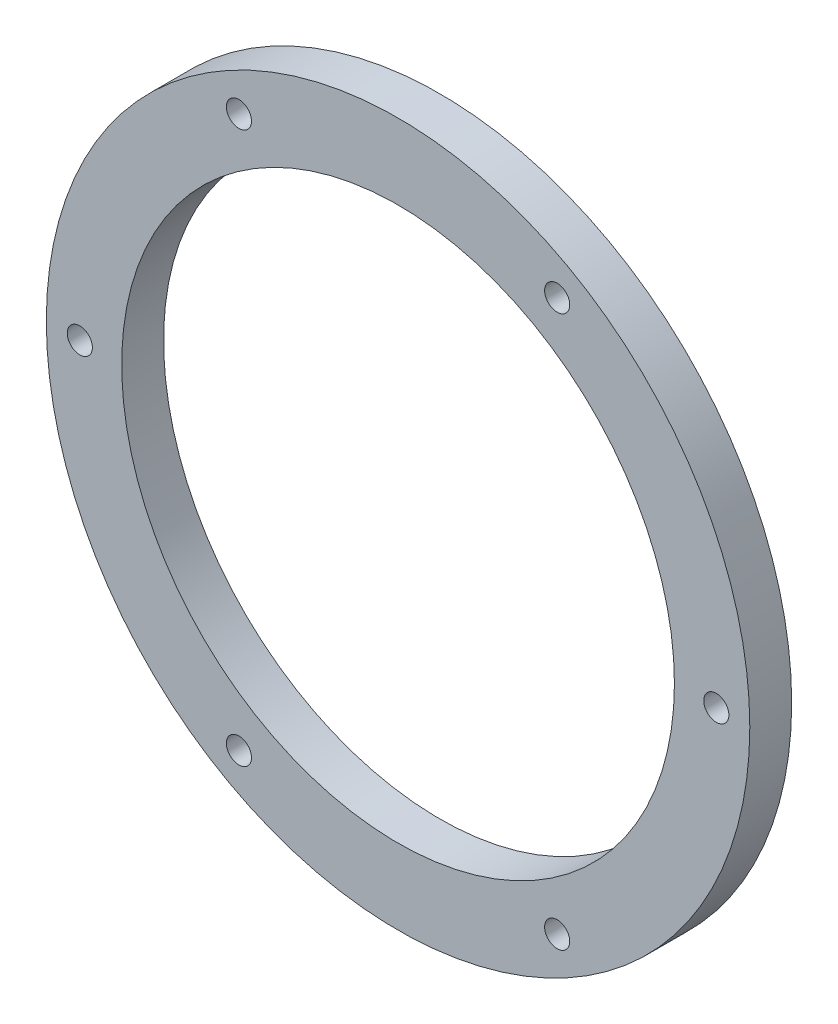
ISO-10303-21;
HEADER;
FILE_DESCRIPTION(('STEP AP214'),'2;1');
FILE_NAME('part.step','',(''),(''),'','','');
FILE_SCHEMA(('AUTOMOTIVE_DESIGN { 1 0 10303 214 1 1 1 1 }'));
ENDSEC;
DATA;
#1=APPLICATION_CONTEXT('core data for automotive mechanical design processes');
#2=APPLICATION_PROTOCOL_DEFINITION('international standard','automotive_design',2000,#1);
#3=PRODUCT_CONTEXT('',#1,'mechanical');
#4=PRODUCT('Part','Part','',(#3));
#5=PRODUCT_RELATED_PRODUCT_CATEGORY('part','',(#4));
#6=PRODUCT_DEFINITION_FORMATION('','',#4);
#7=PRODUCT_DEFINITION_CONTEXT('part definition',#1,'design');
#8=PRODUCT_DEFINITION('design','',#6,#7);
#9=PRODUCT_DEFINITION_SHAPE('','',#8);
#10=(LENGTH_UNIT() NAMED_UNIT(*) SI_UNIT(.MILLI.,.METRE.));
#11=(NAMED_UNIT(*) PLANE_ANGLE_UNIT() SI_UNIT($,.RADIAN.));
#12=(NAMED_UNIT(*) SI_UNIT($,.STERADIAN.) SOLID_ANGLE_UNIT());
#13=UNCERTAINTY_MEASURE_WITH_UNIT(LENGTH_MEASURE(1.E-05),#10,'distance_accuracy_value','');
#14=(GEOMETRIC_REPRESENTATION_CONTEXT(3) GLOBAL_UNCERTAINTY_ASSIGNED_CONTEXT((#13)) GLOBAL_UNIT_ASSIGNED_CONTEXT((#10,
#11,#12)) REPRESENTATION_CONTEXT('',''));
#15=CARTESIAN_POINT('',(0.,0.,0.));
#16=DIRECTION('',(0.,0.,1.));
#17=DIRECTION('',(1.,0.,0.));
#18=AXIS2_PLACEMENT_3D('',#15,#16,#17);
#19=CARTESIAN_POINT('',(0.,0.,5.));
#20=DIRECTION('',(0.,0.,1.));
#21=DIRECTION('',(1.,0.,0.));
#22=AXIS2_PLACEMENT_3D('',#19,#20,#21);
#23=PLANE('',#22);
#24=CARTESIAN_POINT('',(38.,0.,5.));
#25=DIRECTION('',(0.,0.,1.));
#26=DIRECTION('',(1.,0.,0.));
#27=AXIS2_PLACEMENT_3D('',#24,#25,#26);
#28=CIRCLE('',#27,1.5);
#29=CARTESIAN_POINT('',(39.5,0.,5.));
#30=VERTEX_POINT('',#29);
#31=EDGE_CURVE('E49',#30,#30,#28,.T.);
#32=ORIENTED_EDGE('',*,*,#31,.F.);
#33=EDGE_LOOP('',(#32));
#34=FACE_BOUND('',#33,.T.);
#35=CARTESIAN_POINT('',(19.0000000000002,-32.9089653438086,5.));
#36=DIRECTION('',(0.,0.,1.));
#37=DIRECTION('',(1.,0.,0.));
#38=AXIS2_PLACEMENT_3D('',#35,#36,#37);
#39=CIRCLE('',#38,1.5);
#40=CARTESIAN_POINT('',(20.5000000000002,-32.9089653438086,5.));
#41=VERTEX_POINT('',#40);
#42=EDGE_CURVE('E54',#41,#41,#39,.T.);
#43=ORIENTED_EDGE('',*,*,#42,.F.);
#44=EDGE_LOOP('',(#43));
#45=FACE_BOUND('',#44,.T.);
#46=CARTESIAN_POINT('',(-19.0000000000002,-32.9089653438086,5.));
#47=DIRECTION('',(0.,0.,1.));
#48=DIRECTION('',(1.,0.,0.));
#49=AXIS2_PLACEMENT_3D('',#46,#47,#48);
#50=CIRCLE('',#49,1.49999999999996);
#51=CARTESIAN_POINT('',(-17.5000000000002,-32.9089653438086,5.));
#52=VERTEX_POINT('',#51);
#53=EDGE_CURVE('E57',#52,#52,#50,.T.);
#54=ORIENTED_EDGE('',*,*,#53,.F.);
#55=EDGE_LOOP('',(#54));
#56=FACE_BOUND('',#55,.T.);
#57=CARTESIAN_POINT('',(-38.,0.,5.));
#58=DIRECTION('',(0.,0.,1.));
#59=DIRECTION('',(1.,0.,0.));
#60=AXIS2_PLACEMENT_3D('',#57,#58,#59);
#61=CIRCLE('',#60,1.5);
#62=CARTESIAN_POINT('',(-36.5,0.,5.));
#63=VERTEX_POINT('',#62);
#64=EDGE_CURVE('E60',#63,#63,#61,.T.);
#65=ORIENTED_EDGE('',*,*,#64,.F.);
#66=EDGE_LOOP('',(#65));
#67=FACE_BOUND('',#66,.T.);
#68=CARTESIAN_POINT('',(-19.0000000000002,32.9089653438086,5.));
#69=DIRECTION('',(0.,0.,1.));
#70=DIRECTION('',(1.,0.,0.));
#71=AXIS2_PLACEMENT_3D('',#68,#69,#70);
#72=CIRCLE('',#71,1.5);
#73=CARTESIAN_POINT('',(-17.5000000000002,32.9089653438086,5.));
#74=VERTEX_POINT('',#73);
#75=EDGE_CURVE('E63',#74,#74,#72,.T.);
#76=ORIENTED_EDGE('',*,*,#75,.F.);
#77=EDGE_LOOP('',(#76));
#78=FACE_BOUND('',#77,.T.);
#79=CARTESIAN_POINT('',(19.0000000000002,32.9089653438086,5.));
#80=DIRECTION('',(0.,0.,1.));
#81=DIRECTION('',(1.,0.,0.));
#82=AXIS2_PLACEMENT_3D('',#79,#80,#81);
#83=CIRCLE('',#82,1.5);
#84=CARTESIAN_POINT('',(20.5000000000002,32.9089653438086,5.));
#85=VERTEX_POINT('',#84);
#86=EDGE_CURVE('E66',#85,#85,#83,.T.);
#87=ORIENTED_EDGE('',*,*,#86,.F.);
#88=EDGE_LOOP('',(#87));
#89=FACE_BOUND('',#88,.T.);
#90=CARTESIAN_POINT('',(0.,0.,5.));
#91=DIRECTION('',(0.,0.,1.));
#92=DIRECTION('',(1.,0.,0.));
#93=AXIS2_PLACEMENT_3D('',#90,#91,#92);
#94=CIRCLE('',#93,42.);
#95=CARTESIAN_POINT('',(42.,0.,5.));
#96=VERTEX_POINT('',#95);
#97=EDGE_CURVE('E10',#96,#96,#94,.T.);
#98=ORIENTED_EDGE('',*,*,#97,.T.);
#99=EDGE_LOOP('',(#98));
#100=FACE_BOUND('',#99,.T.);
#101=CARTESIAN_POINT('',(0.,0.,5.));
#102=DIRECTION('',(0.,0.,1.));
#103=DIRECTION('',(1.,0.,0.));
#104=AXIS2_PLACEMENT_3D('',#101,#102,#103);
#105=CIRCLE('',#104,33.);
#106=CARTESIAN_POINT('',(33.,0.,5.));
#107=VERTEX_POINT('',#106);
#108=EDGE_CURVE('E44',#107,#107,#105,.T.);
#109=ORIENTED_EDGE('',*,*,#108,.F.);
#110=EDGE_LOOP('',(#109));
#111=FACE_BOUND('',#110,.T.);
#112=ADVANCED_FACE('F33',(#34,#45,#56,#67,#78,#89,#100,#111),#23,.T.);
#113=CARTESIAN_POINT('',(0.,0.,0.));
#114=DIRECTION('',(0.,0.,1.));
#115=DIRECTION('',(1.,0.,0.));
#116=AXIS2_PLACEMENT_3D('',#113,#114,#115);
#117=PLANE('',#116);
#118=CARTESIAN_POINT('',(38.,0.,0.));
#119=DIRECTION('',(0.,0.,-1.));
#120=DIRECTION('',(-1.,0.,0.));
#121=AXIS2_PLACEMENT_3D('',#118,#119,#120);
#122=CIRCLE('',#121,1.5);
#123=CARTESIAN_POINT('',(36.5,0.,0.));
#124=VERTEX_POINT('',#123);
#125=EDGE_CURVE('E73',#124,#124,#122,.T.);
#126=ORIENTED_EDGE('',*,*,#125,.F.);
#127=EDGE_LOOP('',(#126));
#128=FACE_BOUND('',#127,.T.);
#129=CARTESIAN_POINT('',(19.0000000000002,-32.9089653438086,0.));
#130=DIRECTION('',(0.,0.,-1.));
#131=DIRECTION('',(-1.,0.,0.));
#132=AXIS2_PLACEMENT_3D('',#129,#130,#131);
#133=CIRCLE('',#132,1.5);
#134=CARTESIAN_POINT('',(17.5000000000002,-32.9089653438086,0.));
#135=VERTEX_POINT('',#134);
#136=EDGE_CURVE('E76',#135,#135,#133,.T.);
#137=ORIENTED_EDGE('',*,*,#136,.F.);
#138=EDGE_LOOP('',(#137));
#139=FACE_BOUND('',#138,.T.);
#140=CARTESIAN_POINT('',(-19.0000000000002,-32.9089653438086,0.));
#141=DIRECTION('',(0.,0.,-1.));
#142=DIRECTION('',(-1.,0.,0.));
#143=AXIS2_PLACEMENT_3D('',#140,#141,#142);
#144=CIRCLE('',#143,1.49999999999996);
#145=CARTESIAN_POINT('',(-20.5000000000001,-32.9089653438086,0.));
#146=VERTEX_POINT('',#145);
#147=EDGE_CURVE('E79',#146,#146,#144,.T.);
#148=ORIENTED_EDGE('',*,*,#147,.F.);
#149=EDGE_LOOP('',(#148));
#150=FACE_BOUND('',#149,.T.);
#151=CARTESIAN_POINT('',(-38.,0.,0.));
#152=DIRECTION('',(0.,0.,-1.));
#153=DIRECTION('',(-1.,0.,0.));
#154=AXIS2_PLACEMENT_3D('',#151,#152,#153);
#155=CIRCLE('',#154,1.5);
#156=CARTESIAN_POINT('',(-39.5,0.,0.));
#157=VERTEX_POINT('',#156);
#158=EDGE_CURVE('E82',#157,#157,#155,.T.);
#159=ORIENTED_EDGE('',*,*,#158,.F.);
#160=EDGE_LOOP('',(#159));
#161=FACE_BOUND('',#160,.T.);
#162=CARTESIAN_POINT('',(-19.0000000000002,32.9089653438086,0.));
#163=DIRECTION('',(0.,0.,-1.));
#164=DIRECTION('',(-1.,0.,0.));
#165=AXIS2_PLACEMENT_3D('',#162,#163,#164);
#166=CIRCLE('',#165,1.5);
#167=CARTESIAN_POINT('',(-20.5000000000002,32.9089653438086,0.));
#168=VERTEX_POINT('',#167);
#169=EDGE_CURVE('E72',#168,#168,#166,.T.);
#170=ORIENTED_EDGE('',*,*,#169,.F.);
#171=EDGE_LOOP('',(#170));
#172=FACE_BOUND('',#171,.T.);
#173=CARTESIAN_POINT('',(19.0000000000002,32.9089653438086,0.));
#174=DIRECTION('',(0.,0.,-1.));
#175=DIRECTION('',(-1.,0.,0.));
#176=AXIS2_PLACEMENT_3D('',#173,#174,#175);
#177=CIRCLE('',#176,1.5);
#178=CARTESIAN_POINT('',(17.5000000000002,32.9089653438086,0.));
#179=VERTEX_POINT('',#178);
#180=EDGE_CURVE('E69',#179,#179,#177,.T.);
#181=ORIENTED_EDGE('',*,*,#180,.F.);
#182=EDGE_LOOP('',(#181));
#183=FACE_BOUND('',#182,.T.);
#184=CARTESIAN_POINT('',(0.,0.,0.));
#185=DIRECTION('',(0.,0.,1.));
#186=DIRECTION('',(1.,0.,0.));
#187=AXIS2_PLACEMENT_3D('',#184,#185,#186);
#188=CIRCLE('',#187,42.);
#189=CARTESIAN_POINT('',(42.,0.,0.));
#190=VERTEX_POINT('',#189);
#191=EDGE_CURVE('E37',#190,#190,#188,.T.);
#192=ORIENTED_EDGE('',*,*,#191,.F.);
#193=EDGE_LOOP('',(#192));
#194=FACE_BOUND('',#193,.T.);
#195=CARTESIAN_POINT('',(0.,0.,0.));
#196=DIRECTION('',(0.,0.,1.));
#197=DIRECTION('',(1.,0.,0.));
#198=AXIS2_PLACEMENT_3D('',#195,#196,#197);
#199=CIRCLE('',#198,33.);
#200=CARTESIAN_POINT('',(33.,0.,0.));
#201=VERTEX_POINT('',#200);
#202=EDGE_CURVE('E46',#201,#201,#199,.T.);
#203=ORIENTED_EDGE('',*,*,#202,.T.);
#204=EDGE_LOOP('',(#203));
#205=FACE_BOUND('',#204,.T.);
#206=ADVANCED_FACE('F90',(#128,#139,#150,#161,#172,#183,#194,#205),#117,.F.);
#207=CARTESIAN_POINT('',(0.,0.,5.));
#208=DIRECTION('',(0.,0.,-1.));
#209=DIRECTION('',(-1.,0.,0.));
#210=AXIS2_PLACEMENT_3D('',#207,#208,#209);
#211=CYLINDRICAL_SURFACE('',#210,42.);
#212=ORIENTED_EDGE('',*,*,#97,.F.);
#213=EDGE_LOOP('',(#212));
#214=FACE_BOUND('',#213,.T.);
#215=ORIENTED_EDGE('',*,*,#191,.T.);
#216=EDGE_LOOP('',(#215));
#217=FACE_BOUND('',#216,.T.);
#218=ADVANCED_FACE('F35',(#214,#217),#211,.T.);
#219=CARTESIAN_POINT('',(0.,0.,5.));
#220=DIRECTION('',(0.,0.,-1.));
#221=DIRECTION('',(-1.,0.,0.));
#222=AXIS2_PLACEMENT_3D('',#219,#220,#221);
#223=CYLINDRICAL_SURFACE('',#222,33.);
#224=ORIENTED_EDGE('',*,*,#108,.T.);
#225=EDGE_LOOP('',(#224));
#226=FACE_BOUND('',#225,.T.);
#227=ORIENTED_EDGE('',*,*,#202,.F.);
#228=EDGE_LOOP('',(#227));
#229=FACE_BOUND('',#228,.T.);
#230=ADVANCED_FACE('F100',(#226,#229),#223,.F.);
#231=CARTESIAN_POINT('',(19.0000000000002,32.9089653438086,11.));
#232=DIRECTION('',(0.,0.,-1.));
#233=DIRECTION('',(-1.,0.,0.));
#234=AXIS2_PLACEMENT_3D('',#231,#232,#233);
#235=CYLINDRICAL_SURFACE('',#234,1.5);
#236=ORIENTED_EDGE('',*,*,#86,.T.);
#237=EDGE_LOOP('',(#236));
#238=FACE_BOUND('',#237,.T.);
#239=ORIENTED_EDGE('',*,*,#180,.T.);
#240=EDGE_LOOP('',(#239));
#241=FACE_BOUND('',#240,.T.);
#242=ADVANCED_FACE('F102',(#238,#241),#235,.F.);
#243=CARTESIAN_POINT('',(-19.0000000000002,32.9089653438086,11.));
#244=DIRECTION('',(0.,0.,-1.));
#245=DIRECTION('',(-1.,0.,0.));
#246=AXIS2_PLACEMENT_3D('',#243,#244,#245);
#247=CYLINDRICAL_SURFACE('',#246,1.5);
#248=ORIENTED_EDGE('',*,*,#75,.T.);
#249=EDGE_LOOP('',(#248));
#250=FACE_BOUND('',#249,.T.);
#251=ORIENTED_EDGE('',*,*,#169,.T.);
#252=EDGE_LOOP('',(#251));
#253=FACE_BOUND('',#252,.T.);
#254=ADVANCED_FACE('F88',(#250,#253),#247,.F.);
#255=CARTESIAN_POINT('',(-38.,0.,11.));
#256=DIRECTION('',(0.,0.,-1.));
#257=DIRECTION('',(-1.,0.,0.));
#258=AXIS2_PLACEMENT_3D('',#255,#256,#257);
#259=CYLINDRICAL_SURFACE('',#258,1.5);
#260=ORIENTED_EDGE('',*,*,#64,.T.);
#261=EDGE_LOOP('',(#260));
#262=FACE_BOUND('',#261,.T.);
#263=ORIENTED_EDGE('',*,*,#158,.T.);
#264=EDGE_LOOP('',(#263));
#265=FACE_BOUND('',#264,.T.);
#266=ADVANCED_FACE('F133',(#262,#265),#259,.F.);
#267=CARTESIAN_POINT('',(-19.0000000000002,-32.9089653438086,11.));
#268=DIRECTION('',(0.,0.,-1.));
#269=DIRECTION('',(-1.,0.,0.));
#270=AXIS2_PLACEMENT_3D('',#267,#268,#269);
#271=CYLINDRICAL_SURFACE('',#270,1.49999999999996);
#272=ORIENTED_EDGE('',*,*,#53,.T.);
#273=EDGE_LOOP('',(#272));
#274=FACE_BOUND('',#273,.T.);
#275=ORIENTED_EDGE('',*,*,#147,.T.);
#276=EDGE_LOOP('',(#275));
#277=FACE_BOUND('',#276,.T.);
#278=ADVANCED_FACE('F138',(#274,#277),#271,.F.);
#279=CARTESIAN_POINT('',(19.0000000000002,-32.9089653438086,11.));
#280=DIRECTION('',(0.,0.,-1.));
#281=DIRECTION('',(-1.,0.,0.));
#282=AXIS2_PLACEMENT_3D('',#279,#280,#281);
#283=CYLINDRICAL_SURFACE('',#282,1.5);
#284=ORIENTED_EDGE('',*,*,#42,.T.);
#285=EDGE_LOOP('',(#284));
#286=FACE_BOUND('',#285,.T.);
#287=ORIENTED_EDGE('',*,*,#136,.T.);
#288=EDGE_LOOP('',(#287));
#289=FACE_BOUND('',#288,.T.);
#290=ADVANCED_FACE('F144',(#286,#289),#283,.F.);
#291=CARTESIAN_POINT('',(38.,0.,11.));
#292=DIRECTION('',(0.,0.,-1.));
#293=DIRECTION('',(-1.,0.,0.));
#294=AXIS2_PLACEMENT_3D('',#291,#292,#293);
#295=CYLINDRICAL_SURFACE('',#294,1.5);
#296=ORIENTED_EDGE('',*,*,#31,.T.);
#297=EDGE_LOOP('',(#296));
#298=FACE_BOUND('',#297,.T.);
#299=ORIENTED_EDGE('',*,*,#125,.T.);
#300=EDGE_LOOP('',(#299));
#301=FACE_BOUND('',#300,.T.);
#302=ADVANCED_FACE('F148',(#298,#301),#295,.F.);
#303=CLOSED_SHELL('',(#112,#206,#218,#230,#242,#254,#266,#278,#290,#302));
#304=MANIFOLD_SOLID_BREP('B2',#303);
#305=ADVANCED_BREP_SHAPE_REPRESENTATION('',(#18,#304),#14);
#306=SHAPE_DEFINITION_REPRESENTATION(#9,#305);
ENDSEC;
END-ISO-10303-21;
